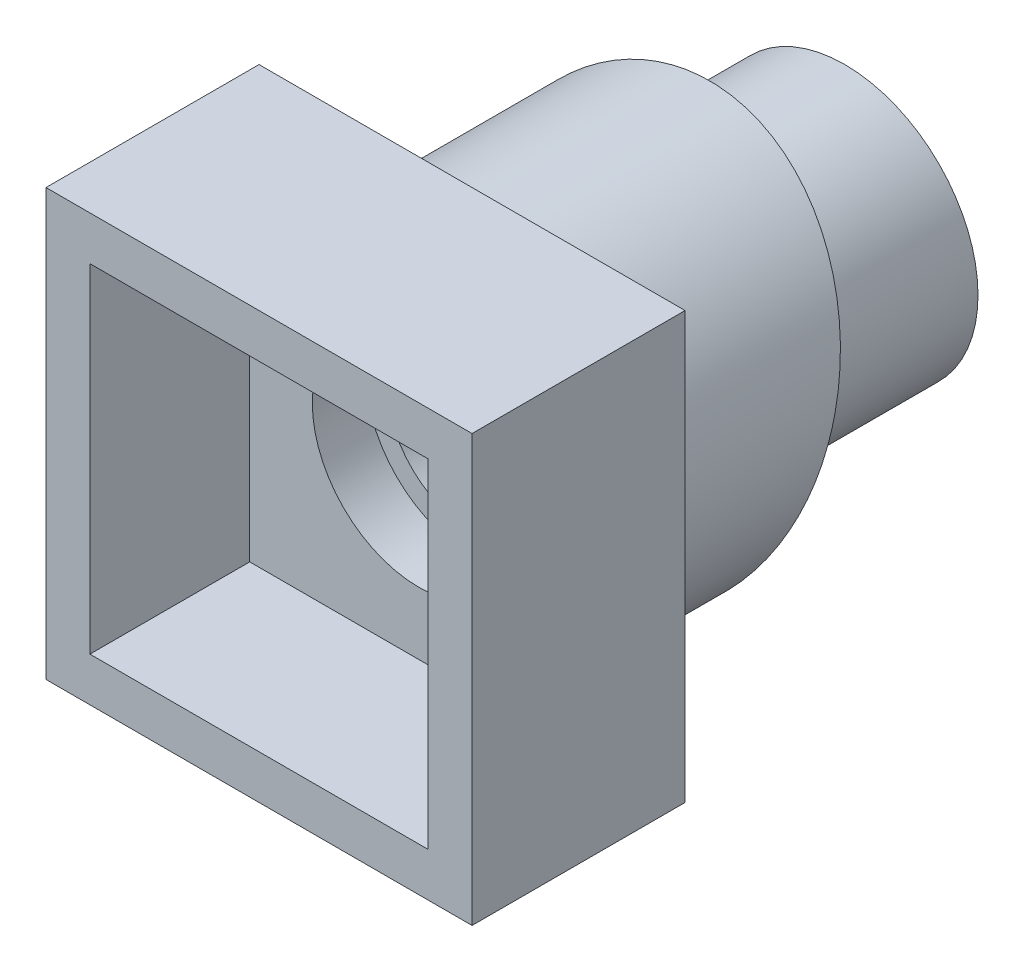
ISO-10303-21;
HEADER;
FILE_DESCRIPTION(('STEP AP214'),'2;1');
FILE_NAME('part.step','',(''),(''),'','','');
FILE_SCHEMA(('AUTOMOTIVE_DESIGN { 1 0 10303 214 1 1 1 1 }'));
ENDSEC;
DATA;
#1=APPLICATION_CONTEXT('core data for automotive mechanical design processes');
#2=APPLICATION_PROTOCOL_DEFINITION('international standard','automotive_design',2000,#1);
#3=PRODUCT_CONTEXT('',#1,'mechanical');
#4=PRODUCT('Part','Part','',(#3));
#5=PRODUCT_RELATED_PRODUCT_CATEGORY('part','',(#4));
#6=PRODUCT_DEFINITION_FORMATION('','',#4);
#7=PRODUCT_DEFINITION_CONTEXT('part definition',#1,'design');
#8=PRODUCT_DEFINITION('design','',#6,#7);
#9=PRODUCT_DEFINITION_SHAPE('','',#8);
#10=(LENGTH_UNIT() NAMED_UNIT(*) SI_UNIT(.MILLI.,.METRE.));
#11=(NAMED_UNIT(*) PLANE_ANGLE_UNIT() SI_UNIT($,.RADIAN.));
#12=(NAMED_UNIT(*) SI_UNIT($,.STERADIAN.) SOLID_ANGLE_UNIT());
#13=UNCERTAINTY_MEASURE_WITH_UNIT(LENGTH_MEASURE(1.E-05),#10,'distance_accuracy_value','');
#14=(GEOMETRIC_REPRESENTATION_CONTEXT(3) GLOBAL_UNCERTAINTY_ASSIGNED_CONTEXT((#13)) GLOBAL_UNIT_ASSIGNED_CONTEXT((#10,
#11,#12)) REPRESENTATION_CONTEXT('',''));
#15=CARTESIAN_POINT('',(0.,0.,0.));
#16=DIRECTION('',(0.,0.,1.));
#17=DIRECTION('',(1.,0.,0.));
#18=AXIS2_PLACEMENT_3D('',#15,#16,#17);
#19=CARTESIAN_POINT('',(0.,0.,7.));
#20=DIRECTION('',(0.,0.,1.));
#21=DIRECTION('',(1.,0.,0.));
#22=AXIS2_PLACEMENT_3D('',#19,#20,#21);
#23=PLANE('',#22);
#24=CARTESIAN_POINT('',(0.,0.,7.));
#25=DIRECTION('',(0.,0.,1.));
#26=DIRECTION('',(1.,0.,0.));
#27=AXIS2_PLACEMENT_3D('',#24,#25,#26);
#28=CIRCLE('',#27,1.6);
#29=CARTESIAN_POINT('',(1.6,0.,7.));
#30=VERTEX_POINT('',#29);
#31=EDGE_CURVE('E177',#30,#30,#28,.T.);
#32=ORIENTED_EDGE('',*,*,#31,.F.);
#33=EDGE_LOOP('',(#32));
#34=FACE_BOUND('',#33,.T.);
#35=CARTESIAN_POINT('',(0.,0.,7.));
#36=DIRECTION('',(0.,0.,1.));
#37=DIRECTION('',(1.,0.,0.));
#38=AXIS2_PLACEMENT_3D('',#35,#36,#37);
#39=CIRCLE('',#38,2.);
#40=CARTESIAN_POINT('',(2.,0.,7.));
#41=VERTEX_POINT('',#40);
#42=EDGE_CURVE('E145',#41,#41,#39,.T.);
#43=ORIENTED_EDGE('',*,*,#42,.T.);
#44=EDGE_LOOP('',(#43));
#45=FACE_BOUND('',#44,.T.);
#46=ADVANCED_FACE('F33',(#34,#45),#23,.T.);
#47=CARTESIAN_POINT('',(0.,0.,0.));
#48=DIRECTION('',(0.,0.,1.));
#49=DIRECTION('',(1.,0.,0.));
#50=AXIS2_PLACEMENT_3D('',#47,#48,#49);
#51=PLANE('',#50);
#52=CARTESIAN_POINT('',(0.,0.,0.));
#53=DIRECTION('',(0.,0.,1.));
#54=DIRECTION('',(1.,0.,0.));
#55=AXIS2_PLACEMENT_3D('',#52,#53,#54);
#56=CIRCLE('',#55,2.5);
#57=CARTESIAN_POINT('',(2.5,0.,0.));
#58=VERTEX_POINT('',#57);
#59=EDGE_CURVE('E41',#58,#58,#56,.T.);
#60=ORIENTED_EDGE('',*,*,#59,.F.);
#61=EDGE_LOOP('',(#60));
#62=FACE_BOUND('',#61,.T.);
#63=CARTESIAN_POINT('',(0.,0.,0.));
#64=DIRECTION('',(0.,0.,1.));
#65=DIRECTION('',(1.,0.,0.));
#66=AXIS2_PLACEMENT_3D('',#63,#64,#65);
#67=CIRCLE('',#66,1.8);
#68=CARTESIAN_POINT('',(1.8,0.,0.));
#69=VERTEX_POINT('',#68);
#70=EDGE_CURVE('E187',#69,#69,#67,.T.);
#71=ORIENTED_EDGE('',*,*,#70,.T.);
#72=EDGE_LOOP('',(#71));
#73=FACE_BOUND('',#72,.T.);
#74=ADVANCED_FACE('F193',(#62,#73),#51,.F.);
#75=CARTESIAN_POINT('',(0.,0.,7.));
#76=DIRECTION('',(0.,0.,-1.));
#77=DIRECTION('',(-1.,0.,0.));
#78=AXIS2_PLACEMENT_3D('',#75,#76,#77);
#79=CYLINDRICAL_SURFACE('',#78,2.5);
#80=CARTESIAN_POINT('',(0.,0.,3.80746668257225));
#81=DIRECTION('',(0.,-0.342020143325676,-0.939692620785906));
#82=DIRECTION('',(0.,0.939692620785906,-0.342020143325676));
#83=AXIS2_PLACEMENT_3D('',#80,#81,#82);
#84=ELLIPSE('',#83,2.66044443118979,2.5);
#85=CARTESIAN_POINT('',(0.,2.5,2.89754109690673));
#86=VERTEX_POINT('',#85);
#87=EDGE_CURVE('E184',#86,#86,#84,.T.);
#88=ORIENTED_EDGE('',*,*,#87,.T.);
#89=EDGE_LOOP('',(#88));
#90=FACE_BOUND('',#89,.T.);
#91=ORIENTED_EDGE('',*,*,#59,.T.);
#92=EDGE_LOOP('',(#91));
#93=FACE_BOUND('',#92,.T.);
#94=ADVANCED_FACE('F35',(#90,#93),#79,.T.);
#95=CARTESIAN_POINT('',(0.,0.,7.));
#96=DIRECTION('',(0.,0.,-1.));
#97=DIRECTION('',(-1.,0.,0.));
#98=AXIS2_PLACEMENT_3D('',#95,#96,#97);
#99=CYLINDRICAL_SURFACE('',#98,1.8);
#100=CARTESIAN_POINT('',(0.,0.,3.80746668257225));
#101=DIRECTION('',(0.,-0.342020143325676,-0.939692620785906));
#102=DIRECTION('',(0.,0.939692620785906,-0.342020143325676));
#103=AXIS2_PLACEMENT_3D('',#100,#101,#102);
#104=ELLIPSE('',#103,1.91551999045665,1.8);
#105=CARTESIAN_POINT('',(0.,1.8,3.15232026089308));
#106=VERTEX_POINT('',#105);
#107=EDGE_CURVE('E11',#106,#106,#104,.T.);
#108=ORIENTED_EDGE('',*,*,#107,.F.);
#109=EDGE_LOOP('',(#108));
#110=FACE_BOUND('',#109,.T.);
#111=ORIENTED_EDGE('',*,*,#70,.F.);
#112=EDGE_LOOP('',(#111));
#113=FACE_BOUND('',#112,.T.);
#114=ADVANCED_FACE('F198',(#110,#113),#99,.F.);
#115=CARTESIAN_POINT('',(0.,0.,-6.40969202087358));
#116=DIRECTION('',(0.,0.,1.));
#117=DIRECTION('',(1.,0.,0.));
#118=AXIS2_PLACEMENT_3D('',#115,#116,#117);
#119=CYLINDRICAL_SURFACE('',#118,1.6);
#120=ORIENTED_EDGE('',*,*,#31,.T.);
#121=EDGE_LOOP('',(#120));
#122=FACE_BOUND('',#121,.T.);
#123=CARTESIAN_POINT('',(0.,0.,3.80746668257226));
#124=DIRECTION('',(0.,-0.342020143325676,-0.939692620785906));
#125=DIRECTION('',(0.,-0.939692620785906,0.342020143325676));
#126=AXIS2_PLACEMENT_3D('',#123,#124,#125);
#127=ELLIPSE('',#126,1.70268443596146,1.6);
#128=CARTESIAN_POINT('',(0.,-1.6,4.38981905739819));
#129=VERTEX_POINT('',#128);
#130=EDGE_CURVE('E176',#129,#129,#127,.F.);
#131=ORIENTED_EDGE('',*,*,#130,.F.);
#132=EDGE_LOOP('',(#131));
#133=FACE_BOUND('',#132,.T.);
#134=ADVANCED_FACE('F200',(#122,#133),#119,.F.);
#135=CARTESIAN_POINT('',(0.,1.2236962039259,3.36207768855867));
#136=DIRECTION('',(0.,-0.342020143325676,-0.939692620785906));
#137=DIRECTION('',(0.,0.939692620785906,-0.342020143325676));
#138=AXIS2_PLACEMENT_3D('',#135,#136,#137);
#139=PLANE('',#138);
#140=ORIENTED_EDGE('',*,*,#130,.T.);
#141=EDGE_LOOP('',(#140));
#142=FACE_BOUND('',#141,.T.);
#143=ORIENTED_EDGE('',*,*,#107,.T.);
#144=EDGE_LOOP('',(#143));
#145=FACE_BOUND('',#144,.T.);
#146=ADVANCED_FACE('F207',(#142,#145),#139,.T.);
#147=CARTESIAN_POINT('',(0.,0.,-6.40969202087358));
#148=DIRECTION('',(0.,0.,1.));
#149=DIRECTION('',(1.,0.,0.));
#150=AXIS2_PLACEMENT_3D('',#147,#148,#149);
#151=CYLINDRICAL_SURFACE('',#150,3.5);
#152=CARTESIAN_POINT('',(0.,0.,7.));
#153=DIRECTION('',(0.,0.,1.));
#154=DIRECTION('',(1.,0.,0.));
#155=AXIS2_PLACEMENT_3D('',#152,#153,#154);
#156=CIRCLE('',#155,3.5);
#157=CARTESIAN_POINT('',(3.5,0.,7.));
#158=VERTEX_POINT('',#157);
#159=EDGE_CURVE('E173',#158,#158,#156,.T.);
#160=ORIENTED_EDGE('',*,*,#159,.F.);
#161=EDGE_LOOP('',(#160));
#162=FACE_BOUND('',#161,.T.);
#163=CARTESIAN_POINT('',(0.,0.,3.80746668257226));
#164=DIRECTION('',(0.,-0.342020143325676,-0.939692620785906));
#165=DIRECTION('',(0.,-0.939692620785906,0.342020143325676));
#166=AXIS2_PLACEMENT_3D('',#163,#164,#165);
#167=ELLIPSE('',#166,3.7246222036657,3.5);
#168=CARTESIAN_POINT('',(0.,-3.5,5.08136250250399));
#169=VERTEX_POINT('',#168);
#170=EDGE_CURVE('E172',#169,#169,#167,.F.);
#171=ORIENTED_EDGE('',*,*,#170,.T.);
#172=EDGE_LOOP('',(#171));
#173=FACE_BOUND('',#172,.T.);
#174=ADVANCED_FACE('F257',(#162,#173),#151,.T.);
#175=ORIENTED_EDGE('',*,*,#87,.F.);
#176=EDGE_LOOP('',(#175));
#177=FACE_BOUND('',#176,.T.);
#178=ORIENTED_EDGE('',*,*,#170,.F.);
#179=EDGE_LOOP('',(#178));
#180=FACE_BOUND('',#179,.T.);
#181=ADVANCED_FACE('F244',(#177,#180),#139,.T.);
#182=CARTESIAN_POINT('',(0.,0.,7.));
#183=DIRECTION('',(0.,0.,1.));
#184=DIRECTION('',(1.,0.,0.));
#185=AXIS2_PLACEMENT_3D('',#182,#183,#184);
#186=PLANE('',#185);
#187=DIRECTION('',(0.,-1.,0.));
#188=VECTOR('',#187,1.);
#189=CARTESIAN_POINT('',(-4.,-4.,7.));
#190=LINE('',#189,#188);
#191=CARTESIAN_POINT('',(-4.,4.,7.));
#192=VERTEX_POINT('',#191);
#193=CARTESIAN_POINT('',(-4.,-4.,7.));
#194=VERTEX_POINT('',#193);
#195=EDGE_CURVE('E149',#192,#194,#190,.T.);
#196=ORIENTED_EDGE('',*,*,#195,.F.);
#197=DIRECTION('',(-1.,0.,0.));
#198=VECTOR('',#197,1.);
#199=CARTESIAN_POINT('',(4.,4.,7.));
#200=LINE('',#199,#198);
#201=CARTESIAN_POINT('',(4.,4.,7.));
#202=VERTEX_POINT('',#201);
#203=EDGE_CURVE('E158',#202,#192,#200,.T.);
#204=ORIENTED_EDGE('',*,*,#203,.F.);
#205=DIRECTION('',(0.,1.,0.));
#206=VECTOR('',#205,1.);
#207=CARTESIAN_POINT('',(4.,-4.,7.));
#208=LINE('',#207,#206);
#209=CARTESIAN_POINT('',(4.,-4.,7.));
#210=VERTEX_POINT('',#209);
#211=EDGE_CURVE('E156',#210,#202,#208,.T.);
#212=ORIENTED_EDGE('',*,*,#211,.F.);
#213=DIRECTION('',(1.,0.,0.));
#214=VECTOR('',#213,1.);
#215=CARTESIAN_POINT('',(4.,-4.,7.));
#216=LINE('',#215,#214);
#217=EDGE_CURVE('E154',#194,#210,#216,.T.);
#218=ORIENTED_EDGE('',*,*,#217,.F.);
#219=EDGE_LOOP('',(#196,#204,#212,#218));
#220=FACE_BOUND('',#219,.T.);
#221=ORIENTED_EDGE('',*,*,#159,.T.);
#222=EDGE_LOOP('',(#221));
#223=FACE_BOUND('',#222,.T.);
#224=ADVANCED_FACE('F242',(#220,#223),#186,.F.);
#225=CARTESIAN_POINT('',(0.,0.,8.));
#226=DIRECTION('',(0.,0.,1.));
#227=DIRECTION('',(1.,0.,0.));
#228=AXIS2_PLACEMENT_3D('',#225,#226,#227);
#229=PLANE('',#228);
#230=DIRECTION('',(0.,1.,0.));
#231=VECTOR('',#230,1.);
#232=CARTESIAN_POINT('',(3.175,-3.175,8.));
#233=LINE('',#232,#231);
#234=CARTESIAN_POINT('',(3.175,-3.175,8.));
#235=VERTEX_POINT('',#234);
#236=CARTESIAN_POINT('',(3.175,3.175,8.));
#237=VERTEX_POINT('',#236);
#238=EDGE_CURVE('E48',#235,#237,#233,.T.);
#239=ORIENTED_EDGE('',*,*,#238,.T.);
#240=DIRECTION('',(-1.,0.,0.));
#241=VECTOR('',#240,1.);
#242=CARTESIAN_POINT('',(-3.175,3.175,8.));
#243=LINE('',#242,#241);
#244=CARTESIAN_POINT('',(-3.175,3.175,8.));
#245=VERTEX_POINT('',#244);
#246=EDGE_CURVE('E52',#237,#245,#243,.T.);
#247=ORIENTED_EDGE('',*,*,#246,.T.);
#248=DIRECTION('',(0.,-1.,0.));
#249=VECTOR('',#248,1.);
#250=CARTESIAN_POINT('',(-3.175,-3.175,8.));
#251=LINE('',#250,#249);
#252=CARTESIAN_POINT('',(-3.175,-3.175,8.));
#253=VERTEX_POINT('',#252);
#254=EDGE_CURVE('E126',#245,#253,#251,.T.);
#255=ORIENTED_EDGE('',*,*,#254,.T.);
#256=DIRECTION('',(1.,0.,0.));
#257=VECTOR('',#256,1.);
#258=CARTESIAN_POINT('',(-3.175,-3.175,8.));
#259=LINE('',#258,#257);
#260=EDGE_CURVE('E107',#253,#235,#259,.T.);
#261=ORIENTED_EDGE('',*,*,#260,.T.);
#262=EDGE_LOOP('',(#239,#247,#255,#261));
#263=FACE_BOUND('',#262,.T.);
#264=CARTESIAN_POINT('',(0.,0.,8.));
#265=DIRECTION('',(0.,0.,1.));
#266=DIRECTION('',(1.,0.,0.));
#267=AXIS2_PLACEMENT_3D('',#264,#265,#266);
#268=CIRCLE('',#267,2.);
#269=CARTESIAN_POINT('',(2.,0.,8.));
#270=VERTEX_POINT('',#269);
#271=EDGE_CURVE('E146',#270,#270,#268,.T.);
#272=ORIENTED_EDGE('',*,*,#271,.F.);
#273=EDGE_LOOP('',(#272));
#274=FACE_BOUND('',#273,.T.);
#275=ADVANCED_FACE('F238',(#263,#274),#229,.T.);
#276=CARTESIAN_POINT('',(-4.,-4.,8.));
#277=DIRECTION('',(1.,0.,0.));
#278=DIRECTION('',(0.,0.,-1.));
#279=AXIS2_PLACEMENT_3D('',#276,#277,#278);
#280=PLANE('',#279);
#281=ORIENTED_EDGE('',*,*,#195,.T.);
#282=DIRECTION('',(0.,0.,-1.));
#283=VECTOR('',#282,1.);
#284=CARTESIAN_POINT('',(-4.,-4.,8.));
#285=LINE('',#284,#283);
#286=CARTESIAN_POINT('',(-4.,-4.,11.));
#287=VERTEX_POINT('',#286);
#288=EDGE_CURVE('E169',#287,#194,#285,.T.);
#289=ORIENTED_EDGE('',*,*,#288,.F.);
#290=DIRECTION('',(0.,-1.,0.));
#291=VECTOR('',#290,1.);
#292=CARTESIAN_POINT('',(-4.,-4.,11.));
#293=LINE('',#292,#291);
#294=CARTESIAN_POINT('',(-4.,4.,11.));
#295=VERTEX_POINT('',#294);
#296=EDGE_CURVE('E139',#295,#287,#293,.T.);
#297=ORIENTED_EDGE('',*,*,#296,.F.);
#298=DIRECTION('',(0.,0.,-1.));
#299=VECTOR('',#298,1.);
#300=CARTESIAN_POINT('',(-4.,4.,8.));
#301=LINE('',#300,#299);
#302=EDGE_CURVE('E160',#295,#192,#301,.T.);
#303=ORIENTED_EDGE('',*,*,#302,.T.);
#304=EDGE_LOOP('',(#281,#289,#297,#303));
#305=FACE_BOUND('',#304,.T.);
#306=ADVANCED_FACE('F241',(#305),#280,.F.);
#307=CARTESIAN_POINT('',(4.,-4.,8.));
#308=DIRECTION('',(0.,1.,0.));
#309=DIRECTION('',(-1.,0.,0.));
#310=AXIS2_PLACEMENT_3D('',#307,#308,#309);
#311=PLANE('',#310);
#312=ORIENTED_EDGE('',*,*,#217,.T.);
#313=DIRECTION('',(0.,0.,-1.));
#314=VECTOR('',#313,1.);
#315=CARTESIAN_POINT('',(4.,-4.,8.));
#316=LINE('',#315,#314);
#317=CARTESIAN_POINT('',(4.,-4.,11.));
#318=VERTEX_POINT('',#317);
#319=EDGE_CURVE('E166',#318,#210,#316,.T.);
#320=ORIENTED_EDGE('',*,*,#319,.F.);
#321=DIRECTION('',(1.,0.,0.));
#322=VECTOR('',#321,1.);
#323=CARTESIAN_POINT('',(-4.,-4.,11.));
#324=LINE('',#323,#322);
#325=EDGE_CURVE('E142',#287,#318,#324,.T.);
#326=ORIENTED_EDGE('',*,*,#325,.F.);
#327=ORIENTED_EDGE('',*,*,#288,.T.);
#328=EDGE_LOOP('',(#312,#320,#326,#327));
#329=FACE_BOUND('',#328,.T.);
#330=ADVANCED_FACE('F249',(#329),#311,.F.);
#331=CARTESIAN_POINT('',(4.,-4.,8.));
#332=DIRECTION('',(-1.,0.,0.));
#333=DIRECTION('',(0.,0.,1.));
#334=AXIS2_PLACEMENT_3D('',#331,#332,#333);
#335=PLANE('',#334);
#336=ORIENTED_EDGE('',*,*,#211,.T.);
#337=DIRECTION('',(0.,0.,-1.));
#338=VECTOR('',#337,1.);
#339=CARTESIAN_POINT('',(4.,4.,8.));
#340=LINE('',#339,#338);
#341=CARTESIAN_POINT('',(4.,4.,11.));
#342=VERTEX_POINT('',#341);
#343=EDGE_CURVE('E163',#342,#202,#340,.T.);
#344=ORIENTED_EDGE('',*,*,#343,.F.);
#345=DIRECTION('',(0.,1.,0.));
#346=VECTOR('',#345,1.);
#347=CARTESIAN_POINT('',(4.,-4.,11.));
#348=LINE('',#347,#346);
#349=EDGE_CURVE('E112',#318,#342,#348,.T.);
#350=ORIENTED_EDGE('',*,*,#349,.F.);
#351=ORIENTED_EDGE('',*,*,#319,.T.);
#352=EDGE_LOOP('',(#336,#344,#350,#351));
#353=FACE_BOUND('',#352,.T.);
#354=ADVANCED_FACE('F233',(#353),#335,.F.);
#355=CARTESIAN_POINT('',(4.,4.,8.));
#356=DIRECTION('',(0.,-1.,0.));
#357=DIRECTION('',(1.,0.,0.));
#358=AXIS2_PLACEMENT_3D('',#355,#356,#357);
#359=PLANE('',#358);
#360=ORIENTED_EDGE('',*,*,#203,.T.);
#361=ORIENTED_EDGE('',*,*,#302,.F.);
#362=DIRECTION('',(-1.,0.,0.));
#363=VECTOR('',#362,1.);
#364=CARTESIAN_POINT('',(-4.,4.,11.));
#365=LINE('',#364,#363);
#366=EDGE_CURVE('E136',#342,#295,#365,.T.);
#367=ORIENTED_EDGE('',*,*,#366,.F.);
#368=ORIENTED_EDGE('',*,*,#343,.T.);
#369=EDGE_LOOP('',(#360,#361,#367,#368));
#370=FACE_BOUND('',#369,.T.);
#371=ADVANCED_FACE('F224',(#370),#359,.F.);
#372=CARTESIAN_POINT('',(0.,0.,8.));
#373=DIRECTION('',(0.,0.,-1.));
#374=DIRECTION('',(-1.,0.,0.));
#375=AXIS2_PLACEMENT_3D('',#372,#373,#374);
#376=CYLINDRICAL_SURFACE('',#375,2.);
#377=ORIENTED_EDGE('',*,*,#271,.T.);
#378=EDGE_LOOP('',(#377));
#379=FACE_BOUND('',#378,.T.);
#380=ORIENTED_EDGE('',*,*,#42,.F.);
#381=EDGE_LOOP('',(#380));
#382=FACE_BOUND('',#381,.T.);
#383=ADVANCED_FACE('F222',(#379,#382),#376,.F.);
#384=CARTESIAN_POINT('',(0.,0.,11.));
#385=DIRECTION('',(0.,0.,-1.));
#386=DIRECTION('',(-1.,0.,0.));
#387=AXIS2_PLACEMENT_3D('',#384,#385,#386);
#388=PLANE('',#387);
#389=ORIENTED_EDGE('',*,*,#349,.T.);
#390=ORIENTED_EDGE('',*,*,#366,.T.);
#391=ORIENTED_EDGE('',*,*,#296,.T.);
#392=ORIENTED_EDGE('',*,*,#325,.T.);
#393=EDGE_LOOP('',(#389,#390,#391,#392));
#394=FACE_BOUND('',#393,.T.);
#395=DIRECTION('',(0.,1.,0.));
#396=VECTOR('',#395,1.);
#397=CARTESIAN_POINT('',(3.175,-3.175,11.));
#398=LINE('',#397,#396);
#399=CARTESIAN_POINT('',(3.175,-3.175,11.));
#400=VERTEX_POINT('',#399);
#401=CARTESIAN_POINT('',(3.175,3.175,11.));
#402=VERTEX_POINT('',#401);
#403=EDGE_CURVE('E97',#400,#402,#398,.T.);
#404=ORIENTED_EDGE('',*,*,#403,.F.);
#405=DIRECTION('',(1.,0.,0.));
#406=VECTOR('',#405,1.);
#407=CARTESIAN_POINT('',(-3.175,-3.175,11.));
#408=LINE('',#407,#406);
#409=CARTESIAN_POINT('',(-3.175,-3.175,11.));
#410=VERTEX_POINT('',#409);
#411=EDGE_CURVE('E120',#410,#400,#408,.T.);
#412=ORIENTED_EDGE('',*,*,#411,.F.);
#413=DIRECTION('',(0.,-1.,0.));
#414=VECTOR('',#413,1.);
#415=CARTESIAN_POINT('',(-3.175,-3.175,11.));
#416=LINE('',#415,#414);
#417=CARTESIAN_POINT('',(-3.175,3.175,11.));
#418=VERTEX_POINT('',#417);
#419=EDGE_CURVE('E118',#418,#410,#416,.T.);
#420=ORIENTED_EDGE('',*,*,#419,.F.);
#421=DIRECTION('',(-1.,0.,0.));
#422=VECTOR('',#421,1.);
#423=CARTESIAN_POINT('',(-3.175,3.175,11.));
#424=LINE('',#423,#422);
#425=EDGE_CURVE('E106',#402,#418,#424,.T.);
#426=ORIENTED_EDGE('',*,*,#425,.F.);
#427=EDGE_LOOP('',(#404,#412,#420,#426));
#428=FACE_BOUND('',#427,.T.);
#429=ADVANCED_FACE('F116',(#394,#428),#388,.F.);
#430=CARTESIAN_POINT('',(3.175,-3.175,11.));
#431=DIRECTION('',(-1.,0.,0.));
#432=DIRECTION('',(0.,0.,1.));
#433=AXIS2_PLACEMENT_3D('',#430,#431,#432);
#434=PLANE('',#433);
#435=ORIENTED_EDGE('',*,*,#238,.F.);
#436=DIRECTION('',(0.,0.,-1.));
#437=VECTOR('',#436,1.);
#438=CARTESIAN_POINT('',(3.175,-3.175,11.));
#439=LINE('',#438,#437);
#440=EDGE_CURVE('E102',#400,#235,#439,.T.);
#441=ORIENTED_EDGE('',*,*,#440,.F.);
#442=ORIENTED_EDGE('',*,*,#403,.T.);
#443=DIRECTION('',(0.,0.,-1.));
#444=VECTOR('',#443,1.);
#445=CARTESIAN_POINT('',(3.175,3.175,11.));
#446=LINE('',#445,#444);
#447=EDGE_CURVE('E100',#402,#237,#446,.T.);
#448=ORIENTED_EDGE('',*,*,#447,.T.);
#449=EDGE_LOOP('',(#435,#441,#442,#448));
#450=FACE_BOUND('',#449,.T.);
#451=ADVANCED_FACE('F99',(#450),#434,.T.);
#452=CARTESIAN_POINT('',(-3.175,3.175,11.));
#453=DIRECTION('',(0.,-1.,0.));
#454=DIRECTION('',(0.,0.,-1.));
#455=AXIS2_PLACEMENT_3D('',#452,#453,#454);
#456=PLANE('',#455);
#457=ORIENTED_EDGE('',*,*,#246,.F.);
#458=ORIENTED_EDGE('',*,*,#447,.F.);
#459=ORIENTED_EDGE('',*,*,#425,.T.);
#460=DIRECTION('',(0.,0.,-1.));
#461=VECTOR('',#460,1.);
#462=CARTESIAN_POINT('',(-3.175,3.175,11.));
#463=LINE('',#462,#461);
#464=EDGE_CURVE('E113',#418,#245,#463,.T.);
#465=ORIENTED_EDGE('',*,*,#464,.T.);
#466=EDGE_LOOP('',(#457,#458,#459,#465));
#467=FACE_BOUND('',#466,.T.);
#468=ADVANCED_FACE('F110',(#467),#456,.T.);
#469=CARTESIAN_POINT('',(-3.175,-3.175,11.));
#470=DIRECTION('',(1.,0.,0.));
#471=DIRECTION('',(0.,0.,-1.));
#472=AXIS2_PLACEMENT_3D('',#469,#470,#471);
#473=PLANE('',#472);
#474=ORIENTED_EDGE('',*,*,#254,.F.);
#475=ORIENTED_EDGE('',*,*,#464,.F.);
#476=ORIENTED_EDGE('',*,*,#419,.T.);
#477=DIRECTION('',(0.,0.,-1.));
#478=VECTOR('',#477,1.);
#479=CARTESIAN_POINT('',(-3.175,-3.175,11.));
#480=LINE('',#479,#478);
#481=EDGE_CURVE('E130',#410,#253,#480,.T.);
#482=ORIENTED_EDGE('',*,*,#481,.T.);
#483=EDGE_LOOP('',(#474,#475,#476,#482));
#484=FACE_BOUND('',#483,.T.);
#485=ADVANCED_FACE('F354',(#484),#473,.T.);
#486=CARTESIAN_POINT('',(-3.175,-3.175,11.));
#487=DIRECTION('',(0.,1.,0.));
#488=DIRECTION('',(0.,0.,1.));
#489=AXIS2_PLACEMENT_3D('',#486,#487,#488);
#490=PLANE('',#489);
#491=ORIENTED_EDGE('',*,*,#260,.F.);
#492=ORIENTED_EDGE('',*,*,#481,.F.);
#493=ORIENTED_EDGE('',*,*,#411,.T.);
#494=ORIENTED_EDGE('',*,*,#440,.T.);
#495=EDGE_LOOP('',(#491,#492,#493,#494));
#496=FACE_BOUND('',#495,.T.);
#497=ADVANCED_FACE('F363',(#496),#490,.T.);
#498=CLOSED_SHELL('',(#46,#74,#94,#114,#134,#146,#174,#181,#224,#275,#306,#330,#354,#371,#383,
#429,#451,#468,#485,#497));
#499=MANIFOLD_SOLID_BREP('B2',#498);
#500=ADVANCED_BREP_SHAPE_REPRESENTATION('',(#18,#499),#14);
#501=SHAPE_DEFINITION_REPRESENTATION(#9,#500);
ENDSEC;
END-ISO-10303-21;
